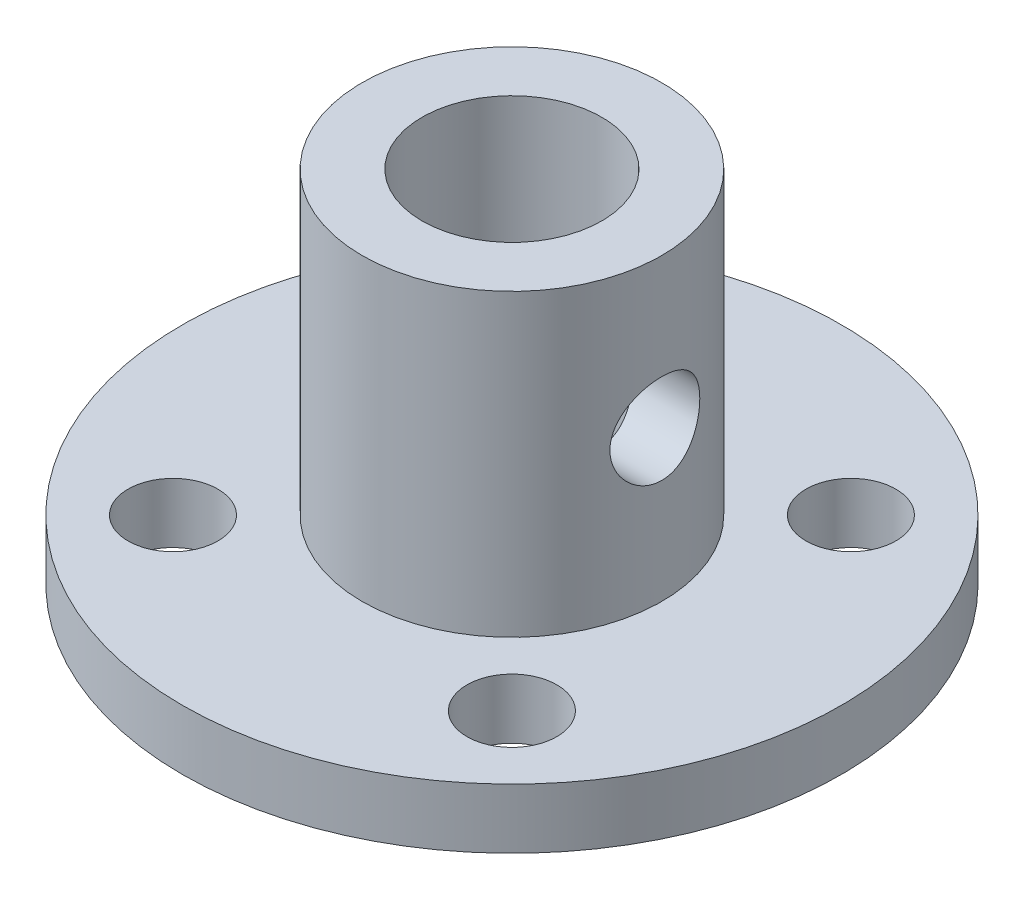
ISO-10303-21;
HEADER;
FILE_DESCRIPTION(('STEP AP214'),'2;1');
FILE_NAME('part.step','',(''),(''),'','','');
FILE_SCHEMA(('AUTOMOTIVE_DESIGN { 1 0 10303 214 1 1 1 1 }'));
ENDSEC;
DATA;
#1=APPLICATION_CONTEXT('core data for automotive mechanical design processes');
#2=APPLICATION_PROTOCOL_DEFINITION('international standard','automotive_design',2000,#1);
#3=PRODUCT_CONTEXT('',#1,'mechanical');
#4=PRODUCT('Part','Part','',(#3));
#5=PRODUCT_RELATED_PRODUCT_CATEGORY('part','',(#4));
#6=PRODUCT_DEFINITION_FORMATION('','',#4);
#7=PRODUCT_DEFINITION_CONTEXT('part definition',#1,'design');
#8=PRODUCT_DEFINITION('design','',#6,#7);
#9=PRODUCT_DEFINITION_SHAPE('','',#8);
#10=(LENGTH_UNIT() NAMED_UNIT(*) SI_UNIT(.MILLI.,.METRE.));
#11=(NAMED_UNIT(*) PLANE_ANGLE_UNIT() SI_UNIT($,.RADIAN.));
#12=(NAMED_UNIT(*) SI_UNIT($,.STERADIAN.) SOLID_ANGLE_UNIT());
#13=UNCERTAINTY_MEASURE_WITH_UNIT(LENGTH_MEASURE(1.E-05),#10,'distance_accuracy_value','');
#14=(GEOMETRIC_REPRESENTATION_CONTEXT(3) GLOBAL_UNCERTAINTY_ASSIGNED_CONTEXT((#13)) GLOBAL_UNIT_ASSIGNED_CONTEXT((#10,
#11,#12)) REPRESENTATION_CONTEXT('',''));
#15=CARTESIAN_POINT('',(0.,0.,0.));
#16=DIRECTION('',(0.,0.,1.));
#17=DIRECTION('',(1.,0.,0.));
#18=AXIS2_PLACEMENT_3D('',#15,#16,#17);
#19=CARTESIAN_POINT('',(0.,2.,0.));
#20=DIRECTION('',(0.,-1.,0.));
#21=DIRECTION('',(0.,0.,-1.));
#22=AXIS2_PLACEMENT_3D('',#19,#20,#21);
#23=CYLINDRICAL_SURFACE('',#22,11.);
#24=CARTESIAN_POINT('',(0.,2.,0.));
#25=DIRECTION('',(0.,1.,0.));
#26=DIRECTION('',(0.,0.,1.));
#27=AXIS2_PLACEMENT_3D('',#24,#25,#26);
#28=CIRCLE('',#27,11.);
#29=CARTESIAN_POINT('',(0.,2.,11.));
#30=VERTEX_POINT('',#29);
#31=EDGE_CURVE('E53',#30,#30,#28,.T.);
#32=ORIENTED_EDGE('',*,*,#31,.F.);
#33=EDGE_LOOP('',(#32));
#34=FACE_BOUND('',#33,.T.);
#35=CARTESIAN_POINT('',(0.,0.,0.));
#36=DIRECTION('',(0.,1.,0.));
#37=DIRECTION('',(0.,0.,1.));
#38=AXIS2_PLACEMENT_3D('',#35,#36,#37);
#39=CIRCLE('',#38,11.);
#40=CARTESIAN_POINT('',(0.,0.,11.));
#41=VERTEX_POINT('',#40);
#42=EDGE_CURVE('E59',#41,#41,#39,.T.);
#43=ORIENTED_EDGE('',*,*,#42,.T.);
#44=EDGE_LOOP('',(#43));
#45=FACE_BOUND('',#44,.T.);
#46=ADVANCED_FACE('F40',(#34,#45),#23,.T.);
#47=CARTESIAN_POINT('',(0.,2.,0.));
#48=DIRECTION('',(0.,1.,0.));
#49=DIRECTION('',(0.,0.,1.));
#50=AXIS2_PLACEMENT_3D('',#47,#48,#49);
#51=PLANE('',#50);
#52=CARTESIAN_POINT('',(-5.65685424949239,2.,-5.65685424949237));
#53=DIRECTION('',(0.,1.,0.));
#54=DIRECTION('',(1.,0.,0.));
#55=AXIS2_PLACEMENT_3D('',#52,#53,#54);
#56=CIRCLE('',#55,1.5);
#57=CARTESIAN_POINT('',(-4.15685424949239,2.,-5.65685424949237));
#58=VERTEX_POINT('',#57);
#59=EDGE_CURVE('E278',#58,#58,#56,.T.);
#60=ORIENTED_EDGE('',*,*,#59,.F.);
#61=EDGE_LOOP('',(#60));
#62=FACE_BOUND('',#61,.T.);
#63=CARTESIAN_POINT('',(-5.65685424949239,2.,5.65685424949237));
#64=DIRECTION('',(0.,1.,0.));
#65=DIRECTION('',(0.,0.,-1.));
#66=AXIS2_PLACEMENT_3D('',#63,#64,#65);
#67=CIRCLE('',#66,1.5);
#68=CARTESIAN_POINT('',(-5.65685424949239,2.,4.15685424949237));
#69=VERTEX_POINT('',#68);
#70=EDGE_CURVE('E270',#69,#69,#67,.T.);
#71=ORIENTED_EDGE('',*,*,#70,.F.);
#72=EDGE_LOOP('',(#71));
#73=FACE_BOUND('',#72,.T.);
#74=CARTESIAN_POINT('',(5.65685424949243,2.,5.65685424949233));
#75=DIRECTION('',(0.,1.,0.));
#76=DIRECTION('',(-1.,0.,0.));
#77=AXIS2_PLACEMENT_3D('',#74,#75,#76);
#78=CIRCLE('',#77,1.5);
#79=CARTESIAN_POINT('',(4.15685424949243,2.,5.65685424949235));
#80=VERTEX_POINT('',#79);
#81=EDGE_CURVE('E262',#80,#80,#78,.T.);
#82=ORIENTED_EDGE('',*,*,#81,.F.);
#83=EDGE_LOOP('',(#82));
#84=FACE_BOUND('',#83,.T.);
#85=CARTESIAN_POINT('',(5.65685424949239,2.,-5.65685424949237));
#86=DIRECTION('',(0.,1.,0.));
#87=DIRECTION('',(0.,0.,1.));
#88=AXIS2_PLACEMENT_3D('',#85,#86,#87);
#89=CIRCLE('',#88,1.5);
#90=CARTESIAN_POINT('',(5.65685424949239,2.,-4.15685424949237));
#91=VERTEX_POINT('',#90);
#92=EDGE_CURVE('E254',#91,#91,#89,.T.);
#93=ORIENTED_EDGE('',*,*,#92,.F.);
#94=EDGE_LOOP('',(#93));
#95=FACE_BOUND('',#94,.T.);
#96=CARTESIAN_POINT('',(0.,2.,0.));
#97=DIRECTION('',(0.,1.,0.));
#98=DIRECTION('',(0.,0.,1.));
#99=AXIS2_PLACEMENT_3D('',#96,#97,#98);
#100=CIRCLE('',#99,5.);
#101=CARTESIAN_POINT('',(0.,2.,5.));
#102=VERTEX_POINT('',#101);
#103=EDGE_CURVE('E10',#102,#102,#100,.T.);
#104=ORIENTED_EDGE('',*,*,#103,.F.);
#105=EDGE_LOOP('',(#104));
#106=FACE_BOUND('',#105,.T.);
#107=ORIENTED_EDGE('',*,*,#31,.T.);
#108=EDGE_LOOP('',(#107));
#109=FACE_BOUND('',#108,.T.);
#110=ADVANCED_FACE('F109',(#62,#73,#84,#95,#106,#109),#51,.T.);
#111=CARTESIAN_POINT('',(0.,0.,0.));
#112=DIRECTION('',(0.,1.,0.));
#113=DIRECTION('',(0.,0.,1.));
#114=AXIS2_PLACEMENT_3D('',#111,#112,#113);
#115=PLANE('',#114);
#116=CARTESIAN_POINT('',(-5.65685424949239,0.,-5.65685424949237));
#117=DIRECTION('',(0.,1.,0.));
#118=DIRECTION('',(1.,0.,0.));
#119=AXIS2_PLACEMENT_3D('',#116,#117,#118);
#120=CIRCLE('',#119,1.5);
#121=CARTESIAN_POINT('',(-4.15685424949239,0.,-5.65685424949237));
#122=VERTEX_POINT('',#121);
#123=EDGE_CURVE('E258',#122,#122,#120,.T.);
#124=ORIENTED_EDGE('',*,*,#123,.T.);
#125=EDGE_LOOP('',(#124));
#126=FACE_BOUND('',#125,.T.);
#127=CARTESIAN_POINT('',(-5.65685424949239,0.,5.65685424949237));
#128=DIRECTION('',(0.,1.,0.));
#129=DIRECTION('',(0.,0.,-1.));
#130=AXIS2_PLACEMENT_3D('',#127,#128,#129);
#131=CIRCLE('',#130,1.5);
#132=CARTESIAN_POINT('',(-5.65685424949239,0.,4.15685424949237));
#133=VERTEX_POINT('',#132);
#134=EDGE_CURVE('E274',#133,#133,#131,.T.);
#135=ORIENTED_EDGE('',*,*,#134,.T.);
#136=EDGE_LOOP('',(#135));
#137=FACE_BOUND('',#136,.T.);
#138=CARTESIAN_POINT('',(5.65685424949243,0.,5.65685424949233));
#139=DIRECTION('',(0.,1.,0.));
#140=DIRECTION('',(-1.,0.,0.));
#141=AXIS2_PLACEMENT_3D('',#138,#139,#140);
#142=CIRCLE('',#141,1.5);
#143=CARTESIAN_POINT('',(4.15685424949243,0.,5.65685424949235));
#144=VERTEX_POINT('',#143);
#145=EDGE_CURVE('E266',#144,#144,#142,.T.);
#146=ORIENTED_EDGE('',*,*,#145,.T.);
#147=EDGE_LOOP('',(#146));
#148=FACE_BOUND('',#147,.T.);
#149=CARTESIAN_POINT('',(5.65685424949239,0.,-5.65685424949237));
#150=DIRECTION('',(0.,1.,0.));
#151=DIRECTION('',(0.,0.,1.));
#152=AXIS2_PLACEMENT_3D('',#149,#150,#151);
#153=CIRCLE('',#152,1.5);
#154=CARTESIAN_POINT('',(5.65685424949239,0.,-4.15685424949237));
#155=VERTEX_POINT('',#154);
#156=EDGE_CURVE('E252',#155,#155,#153,.T.);
#157=ORIENTED_EDGE('',*,*,#156,.T.);
#158=EDGE_LOOP('',(#157));
#159=FACE_BOUND('',#158,.T.);
#160=CARTESIAN_POINT('',(0.,0.,0.));
#161=DIRECTION('',(0.,1.,0.));
#162=DIRECTION('',(0.,0.,1.));
#163=AXIS2_PLACEMENT_3D('',#160,#161,#162);
#164=CIRCLE('',#163,3.);
#165=CARTESIAN_POINT('',(0.,0.,3.));
#166=VERTEX_POINT('',#165);
#167=EDGE_CURVE('E245',#166,#166,#164,.T.);
#168=ORIENTED_EDGE('',*,*,#167,.T.);
#169=EDGE_LOOP('',(#168));
#170=FACE_BOUND('',#169,.T.);
#171=ORIENTED_EDGE('',*,*,#42,.F.);
#172=EDGE_LOOP('',(#171));
#173=FACE_BOUND('',#172,.T.);
#174=ADVANCED_FACE('F107',(#126,#137,#148,#159,#170,#173),#115,.F.);
#175=CARTESIAN_POINT('',(0.,12.,0.));
#176=DIRECTION('',(0.,-1.,0.));
#177=DIRECTION('',(0.,0.,-1.));
#178=AXIS2_PLACEMENT_3D('',#175,#176,#177);
#179=CYLINDRICAL_SURFACE('',#178,5.);
#180=CARTESIAN_POINT('',(-4.76969600708473,7.,-1.5));
#181=CARTESIAN_POINT('',(-4.7696968572698,7.0821945479424,-1.49999897633764));
#182=CARTESIAN_POINT('',(-4.77184390209069,7.16439922414402,-1.49322108167142));
#183=CARTESIAN_POINT('',(-4.780165783029,7.32640524959194,-1.46635844446749));
#184=CARTESIAN_POINT('',(-4.78634196493468,7.40620578650147,-1.44626925573578));
#185=CARTESIAN_POINT('',(-4.80196102485633,7.56103472827173,-1.39352753269955));
#186=CARTESIAN_POINT('',(-4.81139846703232,7.63607082963309,-1.36089589394243));
#187=CARTESIAN_POINT('',(-4.83246932547567,7.7796219339953,-1.28406421917929));
#188=CARTESIAN_POINT('',(-4.8441030704102,7.84813595868444,-1.23986245137053));
#189=CARTESIAN_POINT('',(-4.86866862185766,7.97886639057738,-1.13964754141627));
#190=CARTESIAN_POINT('',(-4.88162808311636,8.04084589794629,-1.08333207175807));
#191=CARTESIAN_POINT('',(-4.90714861936757,8.15463795132251,-0.961136237579599));
#192=CARTESIAN_POINT('',(-4.91970964297705,8.20644919044988,-0.895254645461111));
#193=CARTESIAN_POINT('',(-4.94333214579389,8.29946269983331,-0.75411143779369));
#194=CARTESIAN_POINT('',(-4.95435724342404,8.34042342444281,-0.678684021335814));
#195=CARTESIAN_POINT('',(-4.97334435920684,8.40898725904276,-0.521624645369353));
#196=CARTESIAN_POINT('',(-4.98130703789495,8.43659324985745,-0.439994028387911));
#197=CARTESIAN_POINT('',(-4.99307646003589,8.47688000109051,-0.275323852630828));
#198=CARTESIAN_POINT('',(-4.99699557369338,8.4899651276527,-0.1923913989538));
#199=CARTESIAN_POINT('',(-5.00063201501348,8.50211732464644,-0.0254218237493142));
#200=CARTESIAN_POINT('',(-5.00035022521079,8.50118733940196,0.0586150620503689));
#201=CARTESIAN_POINT('',(-4.99569603817659,8.48560713145698,0.222571156600161));
#202=CARTESIAN_POINT('',(-4.9914542020526,8.47139480619013,0.302536267641342));
#203=CARTESIAN_POINT('',(-4.97951522112593,8.43036866400571,0.458889213442527));
#204=CARTESIAN_POINT('',(-4.97181785750586,8.40355404905733,0.535276821322846));
#205=CARTESIAN_POINT('',(-4.95365220986963,8.33778797658144,0.683347326351281));
#206=CARTESIAN_POINT('',(-4.94315269676706,8.29869879719273,0.754965064694478));
#207=CARTESIAN_POINT('',(-4.92049640648069,8.20960214757177,0.890764673783156));
#208=CARTESIAN_POINT('',(-4.90833923637778,8.15959208703651,0.954944774872131));
#209=CARTESIAN_POINT('',(-4.88311550488165,8.0478022492484,1.0766604815298));
#210=CARTESIAN_POINT('',(-4.87003195321461,7.98564308097026,1.13384458040111));
#211=CARTESIAN_POINT('',(-4.84483979887497,7.85248998210995,1.23707651539824));
#212=CARTESIAN_POINT('',(-4.8327312931702,7.78149517461077,1.28312324482853));
#213=CARTESIAN_POINT('',(-4.81077903197678,7.63176053075101,1.3631399533545));
#214=CARTESIAN_POINT('',(-4.80095810695957,7.55295295413708,1.39698989237679));
#215=CARTESIAN_POINT('',(-4.78496392548436,7.39039279155446,1.45083362878413));
#216=CARTESIAN_POINT('',(-4.7787894791583,7.30664182846544,1.4708319464056));
#217=CARTESIAN_POINT('',(-4.77104849541241,7.13991763926072,1.49574770282165));
#218=CARTESIAN_POINT('',(-4.7693187867044,7.05703177610602,1.50119946380212));
#219=CARTESIAN_POINT('',(-4.77021192441924,6.89152709999013,1.49835947233062));
#220=CARTESIAN_POINT('',(-4.77283416156589,6.80890825126915,1.4900696437133));
#221=CARTESIAN_POINT('',(-4.78197558554912,6.64851162202913,1.4604576357419));
#222=CARTESIAN_POINT('',(-4.78839176507489,6.57066383573648,1.4394796143128));
#223=CARTESIAN_POINT('',(-4.80429141231227,6.41959830918508,1.3854857774794));
#224=CARTESIAN_POINT('',(-4.81377535359073,6.34638128585943,1.3524681034276));
#225=CARTESIAN_POINT('',(-4.83505835023047,6.20448253592787,1.274318711965));
#226=CARTESIAN_POINT('',(-4.84691271069799,6.13597527901421,1.22888564172729));
#227=CARTESIAN_POINT('',(-4.87148205646987,6.0073618938192,1.12755301600385));
#228=CARTESIAN_POINT('',(-4.88419724730003,5.94725778238721,1.07165095534897));
#229=CARTESIAN_POINT('',(-4.90963633548158,5.83481959418526,0.948455132493598));
#230=CARTESIAN_POINT('',(-4.92234245063004,5.78286437101302,0.880811065857434));
#231=CARTESIAN_POINT('',(-4.94584851748651,5.69103329897225,0.737461784590249));
#232=CARTESIAN_POINT('',(-4.95664856384717,5.65115685021854,0.661756970543943));
#233=CARTESIAN_POINT('',(-4.97505970474957,5.5849999694317,0.504935504705221));
#234=CARTESIAN_POINT('',(-4.98269453424966,5.55861798384102,0.423864622037838));
#235=CARTESIAN_POINT('',(-4.99401979596827,5.51993908110958,0.258169966504588));
#236=CARTESIAN_POINT('',(-4.9977113567088,5.50763813405158,0.173547217354763));
#237=CARTESIAN_POINT('',(-5.00066544081399,5.4977769559455,0.006652153882743));
#238=CARTESIAN_POINT('',(-5.00009305111322,5.49966730459217,-0.0755851790862064));
#239=CARTESIAN_POINT('',(-4.99497264465037,5.51682163249912,-0.238519481164404));
#240=CARTESIAN_POINT('',(-4.99042485330462,5.53208485348044,-0.319216537346528));
#241=CARTESIAN_POINT('',(-4.97791168358327,5.57521166139963,-0.475935813041358));
#242=CARTESIAN_POINT('',(-4.96998352900866,5.60293818064901,-0.551998927351392));
#243=CARTESIAN_POINT('',(-4.9515294303945,5.67008191450719,-0.698433237752053));
#244=CARTESIAN_POINT('',(-4.94100305949946,5.70950105028619,-0.768803496050579));
#245=CARTESIAN_POINT('',(-4.91803965828228,5.80037345743003,-0.904301892420563));
#246=CARTESIAN_POINT('',(-4.90555226923559,5.85217143000077,-0.969190250076767));
#247=CARTESIAN_POINT('',(-4.88023537212334,5.9657103883328,-1.08953757134594));
#248=CARTESIAN_POINT('',(-4.86740576641079,6.02745423789815,-1.14499380960194));
#249=CARTESIAN_POINT('',(-4.84240680631319,6.16134077831051,-1.24656269394549));
#250=CARTESIAN_POINT('',(-4.83026852693485,6.23373855339044,-1.29234759757956));
#251=CARTESIAN_POINT('',(-4.80852547508793,6.38555517416102,-1.37104313528776));
#252=CARTESIAN_POINT('',(-4.79891948596955,6.4649706236012,-1.40395995557289));
#253=CARTESIAN_POINT('',(-4.78427816717595,6.61974043160627,-1.4530194253295));
#254=CARTESIAN_POINT('',(-4.7788615484052,6.69460864693099,-1.47058859011232));
#255=CARTESIAN_POINT('',(-4.77157042597167,6.84631522249577,-1.49407818835144));
#256=CARTESIAN_POINT('',(-4.7696952122143,6.92315318464525,-1.50000095706095));
#257=CARTESIAN_POINT('',(-4.76969600708473,7.,-1.5));
#258=B_SPLINE_CURVE_WITH_KNOTS('',3,(#180,#181,#182,#183,#184,#185,#186,#187,#188,#189,#190,
#191,#192,#193,#194,#195,#196,#197,#198,#199,#200,#201,#202,#203,#204,#205,#206,#207,#208,#209,
#210,#211,#212,#213,#214,#215,#216,#217,#218,#219,#220,#221,#222,#223,#224,#225,#226,#227,#228,
#229,#230,#231,#232,#233,#234,#235,#236,#237,#238,#239,#240,#241,#242,#243,#244,#245,#246,#247,
#248,#249,#250,#251,#252,#253,#254,#255,#256,#257),.UNSPECIFIED.,.T.,.F.,(4,2,2,2,2,2,2,2,2,2,2,
2,2,2,2,2,2,2,2,2,2,2,2,2,2,2,2,2,2,2,2,2,2,2,2,2,2,2,4),(0.,0.246300165915543,0.492682641689,
0.738656414466193,0.984667025370101,1.23773150007984,1.49082847871273,1.74915939273645,
2.00743455587877,2.25832140149558,2.5091555410144,2.7520012599088,2.99486235890376,
3.24055209335676,3.4863001659083,3.74152147023278,3.99676812491863,4.25446238246266,
4.51207250628411,4.76008080790309,5.00805439107388,5.24958594938817,5.49115481045787,
5.73920731809388,5.98731925928923,6.24479506100602,6.50225807324202,6.75775391814325,
7.01317662321682,7.2587630391122,7.50433553047754,7.74727096872219,7.99024634491378,
8.24099627054488,8.4918185262989,8.75011639669147,9.00828993963944,9.23861153857448,
9.4688869503356),.UNSPECIFIED.);
#259=CARTESIAN_POINT('',(-4.76969600708473,7.,-1.5));
#260=VERTEX_POINT('',#259);
#261=EDGE_CURVE('E97',#260,#260,#258,.T.);
#262=ORIENTED_EDGE('',*,*,#261,.T.);
#263=EDGE_LOOP('',(#262));
#264=FACE_BOUND('',#263,.T.);
#265=CARTESIAN_POINT('',(4.76969600708473,7.,-1.5));
#266=CARTESIAN_POINT('',(4.7696968572698,6.9178054520576,-1.49999897633764));
#267=CARTESIAN_POINT('',(4.77184390209069,6.83560077585598,-1.49322108167142));
#268=CARTESIAN_POINT('',(4.780165783029,6.67359475040806,-1.46635844446749));
#269=CARTESIAN_POINT('',(4.78634196493468,6.59379421349854,-1.44626925573578));
#270=CARTESIAN_POINT('',(4.80196102485633,6.43896527172827,-1.39352753269955));
#271=CARTESIAN_POINT('',(4.81139846703232,6.36392917036691,-1.36089589394243));
#272=CARTESIAN_POINT('',(4.83246932547567,6.2203780660047,-1.28406421917929));
#273=CARTESIAN_POINT('',(4.84410307041019,6.15186404131556,-1.23986245137053));
#274=CARTESIAN_POINT('',(4.86866862185765,6.02113360942263,-1.13964754141627));
#275=CARTESIAN_POINT('',(4.88162808311636,5.95915410205371,-1.08333207175807));
#276=CARTESIAN_POINT('',(4.90714861936757,5.84536204867749,-0.961136237579599));
#277=CARTESIAN_POINT('',(4.91970964297705,5.79355080955012,-0.895254645461111));
#278=CARTESIAN_POINT('',(4.94333214579389,5.70053730016669,-0.75411143779369));
#279=CARTESIAN_POINT('',(4.95435724342404,5.65957657555719,-0.678684021335814));
#280=CARTESIAN_POINT('',(4.97334435920684,5.59101274095724,-0.521624645369353));
#281=CARTESIAN_POINT('',(4.98130703789495,5.56340675014255,-0.439994028387911));
#282=CARTESIAN_POINT('',(4.99307646003589,5.52311999890949,-0.275323852630829));
#283=CARTESIAN_POINT('',(4.99699557369338,5.5100348723473,-0.1923913989538));
#284=CARTESIAN_POINT('',(5.00063201501348,5.49788267535356,-0.0254218237493144));
#285=CARTESIAN_POINT('',(5.00035022521079,5.49881266059804,0.0586150620503689));
#286=CARTESIAN_POINT('',(4.99569603817659,5.51439286854302,0.222571156600161));
#287=CARTESIAN_POINT('',(4.9914542020526,5.52860519380987,0.302536267641342));
#288=CARTESIAN_POINT('',(4.97951522112593,5.56963133599429,0.458889213442527));
#289=CARTESIAN_POINT('',(4.97181785750586,5.59644595094267,0.535276821322847));
#290=CARTESIAN_POINT('',(4.95365220986963,5.66221202341856,0.683347326351281));
#291=CARTESIAN_POINT('',(4.94315269676706,5.70130120280727,0.754965064694478));
#292=CARTESIAN_POINT('',(4.92049640648069,5.79039785242823,0.890764673783156));
#293=CARTESIAN_POINT('',(4.90833923637778,5.84040791296349,0.954944774872131));
#294=CARTESIAN_POINT('',(4.88311550488165,5.9521977507516,1.0766604815298));
#295=CARTESIAN_POINT('',(4.87003195321461,6.01435691902974,1.13384458040112));
#296=CARTESIAN_POINT('',(4.84483979887497,6.14751001789005,1.23707651539824));
#297=CARTESIAN_POINT('',(4.8327312931702,6.21850482538923,1.28312324482853));
#298=CARTESIAN_POINT('',(4.81077903197678,6.36823946924899,1.3631399533545));
#299=CARTESIAN_POINT('',(4.80095810695957,6.44704704586292,1.39698989237679));
#300=CARTESIAN_POINT('',(4.78496392548436,6.60960720844554,1.45083362878413));
#301=CARTESIAN_POINT('',(4.7787894791583,6.69335817153456,1.4708319464056));
#302=CARTESIAN_POINT('',(4.77104849541241,6.86008236073928,1.49574770282165));
#303=CARTESIAN_POINT('',(4.7693187867044,6.94296822389398,1.50119946380212));
#304=CARTESIAN_POINT('',(4.77021192441924,7.10847290000987,1.49835947233062));
#305=CARTESIAN_POINT('',(4.77283416156589,7.19109174873085,1.4900696437133));
#306=CARTESIAN_POINT('',(4.78197558554912,7.35148837797087,1.4604576357419));
#307=CARTESIAN_POINT('',(4.78839176507489,7.42933616426352,1.4394796143128));
#308=CARTESIAN_POINT('',(4.80429141231227,7.58040169081492,1.3854857774794));
#309=CARTESIAN_POINT('',(4.81377535359073,7.65361871414057,1.3524681034276));
#310=CARTESIAN_POINT('',(4.83505835023047,7.79551746407213,1.274318711965));
#311=CARTESIAN_POINT('',(4.84691271069799,7.86402472098579,1.22888564172729));
#312=CARTESIAN_POINT('',(4.87148205646987,7.9926381061808,1.12755301600385));
#313=CARTESIAN_POINT('',(4.88419724730003,8.05274221761279,1.07165095534897));
#314=CARTESIAN_POINT('',(4.90963633548158,8.16518040581474,0.948455132493598));
#315=CARTESIAN_POINT('',(4.92234245063004,8.21713562898698,0.880811065857434));
#316=CARTESIAN_POINT('',(4.94584851748651,8.30896670102775,0.737461784590249));
#317=CARTESIAN_POINT('',(4.95664856384717,8.34884314978146,0.661756970543944));
#318=CARTESIAN_POINT('',(4.97505970474957,8.4150000305683,0.504935504705222));
#319=CARTESIAN_POINT('',(4.98269453424966,8.44138201615898,0.423864622037839));
#320=CARTESIAN_POINT('',(4.99401979596827,8.48006091889042,0.258169966504588));
#321=CARTESIAN_POINT('',(4.9977113567088,8.49236186594842,0.173547217354763));
#322=CARTESIAN_POINT('',(5.00066544081399,8.5022230440545,0.00665215388274254));
#323=CARTESIAN_POINT('',(5.00009305111322,8.50033269540783,-0.0755851790862069));
#324=CARTESIAN_POINT('',(4.99497264465037,8.48317836750088,-0.238519481164404));
#325=CARTESIAN_POINT('',(4.99042485330463,8.46791514651956,-0.319216537346529));
#326=CARTESIAN_POINT('',(4.97791168358327,8.42478833860038,-0.475935813041358));
#327=CARTESIAN_POINT('',(4.96998352900866,8.39706181935099,-0.551998927351392));
#328=CARTESIAN_POINT('',(4.9515294303945,8.32991808549281,-0.698433237752053));
#329=CARTESIAN_POINT('',(4.94100305949946,8.29049894971381,-0.768803496050579));
#330=CARTESIAN_POINT('',(4.91803965828228,8.19962654256996,-0.904301892420562));
#331=CARTESIAN_POINT('',(4.90555226923559,8.14782856999923,-0.969190250076766));
#332=CARTESIAN_POINT('',(4.88023537212334,8.0342896116672,-1.08953757134594));
#333=CARTESIAN_POINT('',(4.86740576641079,7.97254576210185,-1.14499380960194));
#334=CARTESIAN_POINT('',(4.84240680631319,7.83865922168949,-1.24656269394549));
#335=CARTESIAN_POINT('',(4.83026852693485,7.76626144660956,-1.29234759757956));
#336=CARTESIAN_POINT('',(4.80852547508793,7.61444482583898,-1.37104313528776));
#337=CARTESIAN_POINT('',(4.79891948596955,7.53502937639881,-1.40395995557289));
#338=CARTESIAN_POINT('',(4.78427816717595,7.38025956839373,-1.4530194253295));
#339=CARTESIAN_POINT('',(4.7788615484052,7.30539135306901,-1.47058859011232));
#340=CARTESIAN_POINT('',(4.77157042597167,7.15368477750423,-1.49407818835144));
#341=CARTESIAN_POINT('',(4.7696952122143,7.07684681535475,-1.50000095706095));
#342=CARTESIAN_POINT('',(4.76969600708473,7.,-1.5));
#343=B_SPLINE_CURVE_WITH_KNOTS('',3,(#265,#266,#267,#268,#269,#270,#271,#272,#273,#274,#275,
#276,#277,#278,#279,#280,#281,#282,#283,#284,#285,#286,#287,#288,#289,#290,#291,#292,#293,#294,
#295,#296,#297,#298,#299,#300,#301,#302,#303,#304,#305,#306,#307,#308,#309,#310,#311,#312,#313,
#314,#315,#316,#317,#318,#319,#320,#321,#322,#323,#324,#325,#326,#327,#328,#329,#330,#331,#332,
#333,#334,#335,#336,#337,#338,#339,#340,#341,#342),.UNSPECIFIED.,.T.,.F.,(4,2,2,2,2,2,2,2,2,2,2,
2,2,2,2,2,2,2,2,2,2,2,2,2,2,2,2,2,2,2,2,2,2,2,2,2,2,2,4),(0.,0.246300165915543,0.492682641689,
0.738656414466193,0.984667025370101,1.23773150007984,1.49082847871273,1.74915939273645,
2.00743455587877,2.25832140149558,2.5091555410144,2.7520012599088,2.99486235890376,
3.24055209335676,3.4863001659083,3.74152147023278,3.99676812491863,4.25446238246266,
4.51207250628411,4.76008080790309,5.00805439107388,5.24958594938817,5.49115481045787,
5.73920731809389,5.98731925928923,6.24479506100602,6.50225807324202,6.75775391814325,
7.01317662321682,7.2587630391122,7.50433553047755,7.74727096872219,7.99024634491378,
8.24099627054488,8.4918185262989,8.75011639669147,9.00828993963944,9.23861153857447,
9.4688869503356),.UNSPECIFIED.);
#344=CARTESIAN_POINT('',(4.76969600708473,7.,-1.5));
#345=VERTEX_POINT('',#344);
#346=EDGE_CURVE('E90',#345,#345,#343,.T.);
#347=ORIENTED_EDGE('',*,*,#346,.T.);
#348=EDGE_LOOP('',(#347));
#349=FACE_BOUND('',#348,.T.);
#350=CARTESIAN_POINT('',(0.,12.,0.));
#351=DIRECTION('',(0.,1.,0.));
#352=DIRECTION('',(0.,0.,1.));
#353=AXIS2_PLACEMENT_3D('',#350,#351,#352);
#354=CIRCLE('',#353,5.);
#355=CARTESIAN_POINT('',(0.,12.,5.));
#356=VERTEX_POINT('',#355);
#357=EDGE_CURVE('E62',#356,#356,#354,.T.);
#358=ORIENTED_EDGE('',*,*,#357,.F.);
#359=EDGE_LOOP('',(#358));
#360=FACE_BOUND('',#359,.T.);
#361=ORIENTED_EDGE('',*,*,#103,.T.);
#362=EDGE_LOOP('',(#361));
#363=FACE_BOUND('',#362,.T.);
#364=ADVANCED_FACE('F102',(#264,#349,#360,#363),#179,.T.);
#365=CARTESIAN_POINT('',(0.,12.,0.));
#366=DIRECTION('',(0.,1.,0.));
#367=DIRECTION('',(0.,0.,1.));
#368=AXIS2_PLACEMENT_3D('',#365,#366,#367);
#369=PLANE('',#368);
#370=CARTESIAN_POINT('',(0.,12.,0.));
#371=DIRECTION('',(0.,1.,0.));
#372=DIRECTION('',(0.,0.,1.));
#373=AXIS2_PLACEMENT_3D('',#370,#371,#372);
#374=CIRCLE('',#373,3.);
#375=CARTESIAN_POINT('',(0.,12.,3.));
#376=VERTEX_POINT('',#375);
#377=EDGE_CURVE('E240',#376,#376,#374,.T.);
#378=ORIENTED_EDGE('',*,*,#377,.F.);
#379=EDGE_LOOP('',(#378));
#380=FACE_BOUND('',#379,.T.);
#381=ORIENTED_EDGE('',*,*,#357,.T.);
#382=EDGE_LOOP('',(#381));
#383=FACE_BOUND('',#382,.T.);
#384=ADVANCED_FACE('F106',(#380,#383),#369,.T.);
#385=CARTESIAN_POINT('',(0.,0.,0.));
#386=DIRECTION('',(0.,1.,0.));
#387=DIRECTION('',(0.,0.,1.));
#388=AXIS2_PLACEMENT_3D('',#385,#386,#387);
#389=CYLINDRICAL_SURFACE('',#388,3.);
#390=CARTESIAN_POINT('',(-2.59807621135332,7.,-1.5));
#391=CARTESIAN_POINT('',(-2.59808302092689,6.92183828770712,-1.4999945446118));
#392=CARTESIAN_POINT('',(-2.60165701781635,6.84357788271243,-1.49384995609983));
#393=CARTESIAN_POINT('',(-2.61543549678079,6.68945910298427,-1.46958481484708));
#394=CARTESIAN_POINT('',(-2.62565391083339,6.61360612743489,-1.45143909683127));
#395=CARTESIAN_POINT('',(-2.65124019908098,6.46682250348409,-1.40414992304972));
#396=CARTESIAN_POINT('',(-2.66658065209878,6.39586802128962,-1.3750649287406));
#397=CARTESIAN_POINT('',(-2.70063997225287,6.25986369700492,-1.30690128806456));
#398=CARTESIAN_POINT('',(-2.71935902214097,6.19481417460631,-1.26782210105366));
#399=CARTESIAN_POINT('',(-2.75995303586162,6.06654140716374,-1.17699981079632));
#400=CARTESIAN_POINT('',(-2.7819609545693,6.00391129648968,-1.12447805421566));
#401=CARTESIAN_POINT('',(-2.82557974178559,5.88788741738994,-1.0098807114217));
#402=CARTESIAN_POINT('',(-2.84719040746875,5.83449825612472,-0.94780038867344));
#403=CARTESIAN_POINT('',(-2.88932215429424,5.73494927327851,-0.81073434512182));
#404=CARTESIAN_POINT('',(-2.90967159627259,5.6895193482107,-0.735160783518863));
#405=CARTESIAN_POINT('',(-2.94526134149294,5.61228872013136,-0.576235539899256));
#406=CARTESIAN_POINT('',(-2.96050486775612,5.58047941579424,-0.492888807207233));
#407=CARTESIAN_POINT('',(-2.98320691866356,5.53374300804835,-0.327067415888966));
#408=CARTESIAN_POINT('',(-2.99114220331338,5.5177757104667,-0.244952685733226));
#409=CARTESIAN_POINT('',(-3.00011375769101,5.49975082198744,-0.078855943046772));
#410=CARTESIAN_POINT('',(-3.00115420176885,5.49768481480643,0.00512490876560789));
#411=CARTESIAN_POINT('',(-2.99644472874675,5.50712001095552,0.164748786635625));
#412=CARTESIAN_POINT('',(-2.99127743838241,5.51745702328183,0.240481798765187));
#413=CARTESIAN_POINT('',(-2.97561367889621,5.54932126585699,0.388970657877483));
#414=CARTESIAN_POINT('',(-2.96511681099591,5.57084933346433,0.461726281640888));
#415=CARTESIAN_POINT('',(-2.93957374931482,5.62462384913472,0.603464087354331));
#416=CARTESIAN_POINT('',(-2.92446662293799,5.6570144697581,0.672380135272768));
#417=CARTESIAN_POINT('',(-2.89106468980031,5.73139512430224,0.803965202269993));
#418=CARTESIAN_POINT('',(-2.87276874236226,5.77338859495352,0.866631973257969));
#419=CARTESIAN_POINT('',(-2.83266591598844,5.87034302729952,0.990260491347292));
#420=CARTESIAN_POINT('',(-2.81069063997263,5.92615454248902,1.05050111254404));
#421=CARTESIAN_POINT('',(-2.76681510880218,6.04688458739527,1.16115655544667));
#422=CARTESIAN_POINT('',(-2.74491492398443,6.11181005841109,1.21156381736135));
#423=CARTESIAN_POINT('',(-2.70216234138727,6.25397228863613,1.30425800196332));
#424=CARTESIAN_POINT('',(-2.68146479986061,6.33172903458132,1.34582597246708));
#425=CARTESIAN_POINT('',(-2.64563175417864,6.4944065070385,1.41497866950185));
#426=CARTESIAN_POINT('',(-2.63049045069101,6.57931964952634,1.44257798731633));
#427=CARTESIAN_POINT('',(-2.60916953725552,6.74682176692419,1.48077031653756));
#428=CARTESIAN_POINT('',(-2.60237483772745,6.82906167856533,1.49253768317996));
#429=CARTESIAN_POINT('',(-2.59676879042414,6.99460201227481,1.50227541991714));
#430=CARTESIAN_POINT('',(-2.59795180333967,7.07790164367968,1.50025553597254));
#431=CARTESIAN_POINT('',(-2.60751504810877,7.23348087786809,1.48355406501595));
#432=CARTESIAN_POINT('',(-2.61509381259981,7.30596917666189,1.4702817250687));
#433=CARTESIAN_POINT('',(-2.63541032327012,7.44755167940644,1.43354442694866));
#434=CARTESIAN_POINT('',(-2.64814974007551,7.51664477611991,1.41007616793542));
#435=CARTESIAN_POINT('',(-2.67804333119485,7.65311699635405,1.35247138290733));
#436=CARTESIAN_POINT('',(-2.69537464864595,7.72026852528033,1.31789109553909));
#437=CARTESIAN_POINT('',(-2.73234179245875,7.84820390730849,1.23943059602371));
#438=CARTESIAN_POINT('',(-2.75197880032721,7.90898446526993,1.19554560649832));
#439=CARTESIAN_POINT('',(-2.79431997684504,8.03046815128532,1.09325575079828));
#440=CARTESIAN_POINT('',(-2.81709874731434,8.09019572607649,1.03371790847245));
#441=CARTESIAN_POINT('',(-2.86101352466839,8.19911835699039,0.905106743097433));
#442=CARTESIAN_POINT('',(-2.88214897511564,8.24830985534581,0.83603021198302));
#443=CARTESIAN_POINT('',(-2.92112042536435,8.33586058892515,0.687803043838136));
#444=CARTESIAN_POINT('',(-2.93885462508044,8.37389967731637,0.60843464636117));
#445=CARTESIAN_POINT('',(-2.96825032438952,8.43570685578609,0.443283546961623));
#446=CARTESIAN_POINT('',(-2.9799171551456,8.45948747704946,0.357506552088264));
#447=CARTESIAN_POINT('',(-2.99501262272824,8.49005284626199,0.190469523495626));
#448=CARTESIAN_POINT('',(-2.99909891862287,8.49819681381417,0.109517165775686));
#449=CARTESIAN_POINT('',(-3.00063195562697,8.5012648981816,-0.0526889789268053));
#450=CARTESIAN_POINT('',(-2.99808102100335,8.49619364278534,-0.13394265044263));
#451=CARTESIAN_POINT('',(-2.98700953256884,8.47387538980656,-0.288806988475721));
#452=CARTESIAN_POINT('',(-2.97889342001985,8.45745272611349,-0.362568476716896));
#453=CARTESIAN_POINT('',(-2.95788140495135,8.41400950104554,-0.506168928275427));
#454=CARTESIAN_POINT('',(-2.94498481699194,8.38698741985982,-0.576007327433263));
#455=CARTESIAN_POINT('',(-2.9148889612218,8.32190942175104,-0.713135109367327));
#456=CARTESIAN_POINT('',(-2.89752925798199,8.28343101518824,-0.780187714050069));
#457=CARTESIAN_POINT('',(-2.86032199712739,8.19706310371143,-0.907161962721037));
#458=CARTESIAN_POINT('',(-2.84047329837541,8.14916927632649,-0.967080311122361));
#459=CARTESIAN_POINT('',(-2.79792915339941,8.03980429146595,-1.08437100623534));
#460=CARTESIAN_POINT('',(-2.77514698517547,7.97745626878421,-1.14089652680891));
#461=CARTESIAN_POINT('',(-2.73094614244278,7.84382391830535,-1.24299493109201));
#462=CARTESIAN_POINT('',(-2.70952868642798,7.77253176869847,-1.28855812501509));
#463=CARTESIAN_POINT('',(-2.66999407957374,7.62004503012857,-1.36864661967848));
#464=CARTESIAN_POINT('',(-2.65200261384405,7.5386087033069,-1.40277759894141));
#465=CARTESIAN_POINT('',(-2.62299234492527,7.37000139349033,-1.45631806425962));
#466=CARTESIAN_POINT('',(-2.61195024221553,7.28285066663097,-1.47577678676302));
#467=CARTESIAN_POINT('',(-2.60293908902686,7.16229196652201,-1.49155051179662));
#468=CARTESIAN_POINT('',(-2.60112193507728,7.12994815840318,-1.49471415744578));
#469=CARTESIAN_POINT('',(-2.59868903831625,7.06507527897664,-1.49894010763494));
#470=CARTESIAN_POINT('',(-2.59807337587664,7.03254619542119,-1.50000227159981));
#471=CARTESIAN_POINT('',(-2.59807621135332,7.,-1.5));
#472=B_SPLINE_CURVE_WITH_KNOTS('',3,(#390,#391,#392,#393,#394,#395,#396,#397,#398,#399,#400,
#401,#402,#403,#404,#405,#406,#407,#408,#409,#410,#411,#412,#413,#414,#415,#416,#417,#418,#419,
#420,#421,#422,#423,#424,#425,#426,#427,#428,#429,#430,#431,#432,#433,#434,#435,#436,#437,#438,
#439,#440,#441,#442,#443,#444,#445,#446,#447,#448,#449,#450,#451,#452,#453,#454,#455,#456,#457,
#458,#459,#460,#461,#462,#463,#464,#465,#466,#467,#468,#469,#470,#471),.UNSPECIFIED.,.T.,.F.,(4,
2,2,2,2,2,2,2,2,2,2,2,2,2,2,2,2,2,2,2,2,2,2,2,2,2,2,2,2,2,2,2,2,2,2,2,2,2,2,2,4),(0.,
0.234348183892072,0.469189339237207,0.702792893878329,0.936409088167725,1.18929346874735,
1.44230356626556,1.71236838358145,1.98226240445837,2.23295227451903,2.4834903552906,
2.71224146226808,2.94100968776183,3.1729430209672,3.40495949025408,3.65890787185336,
3.91305072368878,4.18333262594173,4.45333161317557,4.70193436281318,4.9503613978256,
5.17161275136038,5.39293578654095,5.62450944609132,5.85620229330071,6.1171011537092,
6.37808797467303,6.64596272119449,6.91360169713157,7.1566840558423,7.39968130190958,
7.62666637307239,7.8536840026802,8.09041126079208,8.32724745151079,8.58765362775101,
8.84828914267731,9.11716123557908,9.38512699504141,9.48270202777964,9.58028358741811),.UNSPECIFIED.);
#473=CARTESIAN_POINT('',(-2.59807621135332,7.,-1.5));
#474=VERTEX_POINT('',#473);
#475=EDGE_CURVE('E43',#474,#474,#472,.T.);
#476=ORIENTED_EDGE('',*,*,#475,.T.);
#477=EDGE_LOOP('',(#476));
#478=FACE_BOUND('',#477,.T.);
#479=CARTESIAN_POINT('',(2.59807621135332,7.,-1.5));
#480=CARTESIAN_POINT('',(2.59808302092689,7.07816171229288,-1.4999945446118));
#481=CARTESIAN_POINT('',(2.60165701781635,7.15642211728757,-1.49384995609983));
#482=CARTESIAN_POINT('',(2.61543549678079,7.31054089701573,-1.46958481484708));
#483=CARTESIAN_POINT('',(2.62565391083339,7.38639387256511,-1.45143909683127));
#484=CARTESIAN_POINT('',(2.65124019908098,7.53317749651591,-1.40414992304972));
#485=CARTESIAN_POINT('',(2.66658065209878,7.60413197871038,-1.3750649287406));
#486=CARTESIAN_POINT('',(2.70063997225287,7.74013630299508,-1.30690128806456));
#487=CARTESIAN_POINT('',(2.71935902214097,7.80518582539368,-1.26782210105366));
#488=CARTESIAN_POINT('',(2.75995303586162,7.93345859283626,-1.17699981079632));
#489=CARTESIAN_POINT('',(2.7819609545693,7.99608870351031,-1.12447805421566));
#490=CARTESIAN_POINT('',(2.82557974178559,8.11211258261006,-1.0098807114217));
#491=CARTESIAN_POINT('',(2.84719040746875,8.16550174387528,-0.94780038867344));
#492=CARTESIAN_POINT('',(2.88932215429424,8.26505072672149,-0.810734345121819));
#493=CARTESIAN_POINT('',(2.90967159627259,8.3104806517893,-0.735160783518862));
#494=CARTESIAN_POINT('',(2.94526134149294,8.38771127986865,-0.576235539899256));
#495=CARTESIAN_POINT('',(2.96050486775612,8.41952058420575,-0.492888807207233));
#496=CARTESIAN_POINT('',(2.98320691866356,8.46625699195165,-0.327067415888966));
#497=CARTESIAN_POINT('',(2.99114220331338,8.4822242895333,-0.244952685733227));
#498=CARTESIAN_POINT('',(3.00011375769101,8.50024917801256,-0.0788559430467726));
#499=CARTESIAN_POINT('',(3.00115420176885,8.50231518519356,0.00512490876560759));
#500=CARTESIAN_POINT('',(2.99644472874675,8.49287998904448,0.164748786635625));
#501=CARTESIAN_POINT('',(2.99127743838241,8.48254297671817,0.240481798765187));
#502=CARTESIAN_POINT('',(2.97561367889621,8.45067873414301,0.388970657877483));
#503=CARTESIAN_POINT('',(2.96511681099591,8.42915066653567,0.461726281640888));
#504=CARTESIAN_POINT('',(2.93957374931482,8.37537615086528,0.60346408735433));
#505=CARTESIAN_POINT('',(2.92446662293799,8.3429855302419,0.672380135272767));
#506=CARTESIAN_POINT('',(2.89106468980031,8.26860487569776,0.803965202269993));
#507=CARTESIAN_POINT('',(2.87276874236226,8.22661140504647,0.866631973257969));
#508=CARTESIAN_POINT('',(2.83266591598844,8.12965697270048,0.990260491347292));
#509=CARTESIAN_POINT('',(2.81069063997263,8.07384545751099,1.05050111254404));
#510=CARTESIAN_POINT('',(2.76681510880218,7.95311541260474,1.16115655544667));
#511=CARTESIAN_POINT('',(2.74491492398443,7.88818994158891,1.21156381736135));
#512=CARTESIAN_POINT('',(2.70216234138727,7.74602771136387,1.30425800196332));
#513=CARTESIAN_POINT('',(2.68146479986061,7.66827096541868,1.34582597246708));
#514=CARTESIAN_POINT('',(2.64563175417864,7.5055934929615,1.41497866950185));
#515=CARTESIAN_POINT('',(2.63049045069101,7.42068035047366,1.44257798731633));
#516=CARTESIAN_POINT('',(2.60916953725552,7.25317823307581,1.48077031653756));
#517=CARTESIAN_POINT('',(2.60237483772745,7.17093832143467,1.49253768317996));
#518=CARTESIAN_POINT('',(2.59676879042414,7.00539798772519,1.50227541991714));
#519=CARTESIAN_POINT('',(2.59795180333967,6.92209835632032,1.50025553597254));
#520=CARTESIAN_POINT('',(2.60751504810877,6.76651912213191,1.48355406501595));
#521=CARTESIAN_POINT('',(2.61509381259981,6.69403082333811,1.4702817250687));
#522=CARTESIAN_POINT('',(2.63541032327012,6.55244832059356,1.43354442694866));
#523=CARTESIAN_POINT('',(2.64814974007551,6.48335522388009,1.41007616793542));
#524=CARTESIAN_POINT('',(2.67804333119485,6.34688300364596,1.35247138290733));
#525=CARTESIAN_POINT('',(2.69537464864595,6.27973147471967,1.31789109553908));
#526=CARTESIAN_POINT('',(2.73234179245875,6.15179609269151,1.23943059602371));
#527=CARTESIAN_POINT('',(2.75197880032721,6.09101553473007,1.19554560649832));
#528=CARTESIAN_POINT('',(2.79431997684504,5.96953184871468,1.09325575079828));
#529=CARTESIAN_POINT('',(2.81709874731434,5.90980427392351,1.03371790847245));
#530=CARTESIAN_POINT('',(2.86101352466839,5.80088164300961,0.905106743097433));
#531=CARTESIAN_POINT('',(2.88214897511564,5.75169014465419,0.836030211983021));
#532=CARTESIAN_POINT('',(2.92112042536435,5.66413941107485,0.687803043838135));
#533=CARTESIAN_POINT('',(2.93885462508044,5.62610032268363,0.608434646361169));
#534=CARTESIAN_POINT('',(2.96825032438952,5.56429314421391,0.443283546961622));
#535=CARTESIAN_POINT('',(2.9799171551456,5.54051252295054,0.357506552088263));
#536=CARTESIAN_POINT('',(2.99501262272824,5.50994715373801,0.190469523495625));
#537=CARTESIAN_POINT('',(2.99909891862287,5.50180318618583,0.109517165775685));
#538=CARTESIAN_POINT('',(3.00063195562697,5.4987351018184,-0.0526889789268059));
#539=CARTESIAN_POINT('',(2.99808102100335,5.50380635721465,-0.133942650442631));
#540=CARTESIAN_POINT('',(2.98700953256884,5.52612461019344,-0.288806988475721));
#541=CARTESIAN_POINT('',(2.97889342001985,5.54254727388651,-0.362568476716896));
#542=CARTESIAN_POINT('',(2.95788140495135,5.58599049895446,-0.506168928275427));
#543=CARTESIAN_POINT('',(2.94498481699194,5.61301258014018,-0.576007327433264));
#544=CARTESIAN_POINT('',(2.9148889612218,5.67809057824896,-0.713135109367327));
#545=CARTESIAN_POINT('',(2.89752925798199,5.71656898481176,-0.780187714050069));
#546=CARTESIAN_POINT('',(2.86032199712739,5.80293689628858,-0.907161962721037));
#547=CARTESIAN_POINT('',(2.84047329837541,5.85083072367351,-0.967080311122361));
#548=CARTESIAN_POINT('',(2.79792915339941,5.96019570853405,-1.08437100623534));
#549=CARTESIAN_POINT('',(2.77514698517547,6.02254373121579,-1.14089652680891));
#550=CARTESIAN_POINT('',(2.73094614244278,6.15617608169466,-1.24299493109201));
#551=CARTESIAN_POINT('',(2.70952868642798,6.22746823130153,-1.28855812501509));
#552=CARTESIAN_POINT('',(2.66999407957374,6.37995496987143,-1.36864661967848));
#553=CARTESIAN_POINT('',(2.65200261384405,6.46139129669311,-1.40277759894141));
#554=CARTESIAN_POINT('',(2.62299234492527,6.62999860650967,-1.45631806425962));
#555=CARTESIAN_POINT('',(2.61195024221553,6.71714933336903,-1.47577678676302));
#556=CARTESIAN_POINT('',(2.60293908902686,6.837708033478,-1.49155051179662));
#557=CARTESIAN_POINT('',(2.60112193507728,6.87005184159682,-1.49471415744578));
#558=CARTESIAN_POINT('',(2.59868903831625,6.93492472102336,-1.49894010763494));
#559=CARTESIAN_POINT('',(2.59807337587664,6.96745380457881,-1.50000227159981));
#560=CARTESIAN_POINT('',(2.59807621135332,7.,-1.5));
#561=B_SPLINE_CURVE_WITH_KNOTS('',3,(#479,#480,#481,#482,#483,#484,#485,#486,#487,#488,#489,
#490,#491,#492,#493,#494,#495,#496,#497,#498,#499,#500,#501,#502,#503,#504,#505,#506,#507,#508,
#509,#510,#511,#512,#513,#514,#515,#516,#517,#518,#519,#520,#521,#522,#523,#524,#525,#526,#527,
#528,#529,#530,#531,#532,#533,#534,#535,#536,#537,#538,#539,#540,#541,#542,#543,#544,#545,#546,
#547,#548,#549,#550,#551,#552,#553,#554,#555,#556,#557,#558,#559,#560),.UNSPECIFIED.,.T.,.F.,(4,
2,2,2,2,2,2,2,2,2,2,2,2,2,2,2,2,2,2,2,2,2,2,2,2,2,2,2,2,2,2,2,2,2,2,2,2,2,2,2,4),(0.,
0.234348183892072,0.469189339237207,0.702792893878327,0.936409088167723,1.18929346874735,
1.44230356626556,1.71236838358145,1.98226240445837,2.23295227451903,2.4834903552906,
2.71224146226808,2.94100968776183,3.1729430209672,3.40495949025408,3.65890787185336,
3.91305072368878,4.18333262594173,4.45333161317557,4.70193436281318,4.9503613978256,
5.17161275136038,5.39293578654095,5.62450944609132,5.85620229330071,6.1171011537092,
6.37808797467303,6.64596272119449,6.91360169713157,7.1566840558423,7.39968130190958,
7.62666637307239,7.8536840026802,8.09041126079208,8.32724745151079,8.58765362775101,
8.84828914267731,9.11716123557908,9.38512699504141,9.48270202777964,9.58028358741811),.UNSPECIFIED.);
#562=CARTESIAN_POINT('',(2.59807621135332,7.,-1.5));
#563=VERTEX_POINT('',#562);
#564=EDGE_CURVE('E67',#563,#563,#561,.T.);
#565=ORIENTED_EDGE('',*,*,#564,.T.);
#566=EDGE_LOOP('',(#565));
#567=FACE_BOUND('',#566,.T.);
#568=ORIENTED_EDGE('',*,*,#167,.F.);
#569=EDGE_LOOP('',(#568));
#570=FACE_BOUND('',#569,.T.);
#571=ORIENTED_EDGE('',*,*,#377,.T.);
#572=EDGE_LOOP('',(#571));
#573=FACE_BOUND('',#572,.T.);
#574=ADVANCED_FACE('F73',(#478,#567,#570,#573),#389,.F.);
#575=CARTESIAN_POINT('',(5.65685424949239,0.,-5.65685424949237));
#576=DIRECTION('',(0.,1.,0.));
#577=DIRECTION('',(0.,0.,1.));
#578=AXIS2_PLACEMENT_3D('',#575,#576,#577);
#579=CYLINDRICAL_SURFACE('',#578,1.5);
#580=ORIENTED_EDGE('',*,*,#156,.F.);
#581=EDGE_LOOP('',(#580));
#582=FACE_BOUND('',#581,.T.);
#583=ORIENTED_EDGE('',*,*,#92,.T.);
#584=EDGE_LOOP('',(#583));
#585=FACE_BOUND('',#584,.T.);
#586=ADVANCED_FACE('F140',(#582,#585),#579,.F.);
#587=CARTESIAN_POINT('',(5.65685424949243,0.,5.65685424949233));
#588=DIRECTION('',(0.,1.,0.));
#589=DIRECTION('',(0.,0.,1.));
#590=AXIS2_PLACEMENT_3D('',#587,#588,#589);
#591=CYLINDRICAL_SURFACE('',#590,1.5);
#592=ORIENTED_EDGE('',*,*,#145,.F.);
#593=EDGE_LOOP('',(#592));
#594=FACE_BOUND('',#593,.T.);
#595=ORIENTED_EDGE('',*,*,#81,.T.);
#596=EDGE_LOOP('',(#595));
#597=FACE_BOUND('',#596,.T.);
#598=ADVANCED_FACE('F150',(#594,#597),#591,.F.);
#599=CARTESIAN_POINT('',(-5.65685424949239,0.,5.65685424949237));
#600=DIRECTION('',(0.,1.,0.));
#601=DIRECTION('',(0.,0.,1.));
#602=AXIS2_PLACEMENT_3D('',#599,#600,#601);
#603=CYLINDRICAL_SURFACE('',#602,1.5);
#604=ORIENTED_EDGE('',*,*,#134,.F.);
#605=EDGE_LOOP('',(#604));
#606=FACE_BOUND('',#605,.T.);
#607=ORIENTED_EDGE('',*,*,#70,.T.);
#608=EDGE_LOOP('',(#607));
#609=FACE_BOUND('',#608,.T.);
#610=ADVANCED_FACE('F155',(#606,#609),#603,.F.);
#611=CARTESIAN_POINT('',(-5.65685424949239,0.,-5.65685424949237));
#612=DIRECTION('',(0.,1.,0.));
#613=DIRECTION('',(0.,0.,1.));
#614=AXIS2_PLACEMENT_3D('',#611,#612,#613);
#615=CYLINDRICAL_SURFACE('',#614,1.5);
#616=ORIENTED_EDGE('',*,*,#123,.F.);
#617=EDGE_LOOP('',(#616));
#618=FACE_BOUND('',#617,.T.);
#619=ORIENTED_EDGE('',*,*,#59,.T.);
#620=EDGE_LOOP('',(#619));
#621=FACE_BOUND('',#620,.T.);
#622=ADVANCED_FACE('F83',(#618,#621),#615,.F.);
#623=CARTESIAN_POINT('',(-11.,7.,0.));
#624=DIRECTION('',(1.,0.,0.));
#625=DIRECTION('',(0.,0.,-1.));
#626=AXIS2_PLACEMENT_3D('',#623,#624,#625);
#627=CYLINDRICAL_SURFACE('',#626,1.5);
#628=ORIENTED_EDGE('',*,*,#564,.F.);
#629=EDGE_LOOP('',(#628));
#630=FACE_BOUND('',#629,.T.);
#631=ORIENTED_EDGE('',*,*,#346,.F.);
#632=EDGE_LOOP('',(#631));
#633=FACE_BOUND('',#632,.T.);
#634=ADVANCED_FACE('F81',(#630,#633),#627,.F.);
#635=ORIENTED_EDGE('',*,*,#475,.F.);
#636=EDGE_LOOP('',(#635));
#637=FACE_BOUND('',#636,.T.);
#638=ORIENTED_EDGE('',*,*,#261,.F.);
#639=EDGE_LOOP('',(#638));
#640=FACE_BOUND('',#639,.T.);
#641=ADVANCED_FACE('F77',(#637,#640),#627,.F.);
#642=CLOSED_SHELL('',(#46,#110,#174,#364,#384,#574,#586,#598,#610,#622,#634,#641));
#643=MANIFOLD_SOLID_BREP('B2',#642);
#644=ADVANCED_BREP_SHAPE_REPRESENTATION('',(#18,#643),#14);
#645=SHAPE_DEFINITION_REPRESENTATION(#9,#644);
ENDSEC;
END-ISO-10303-21;
